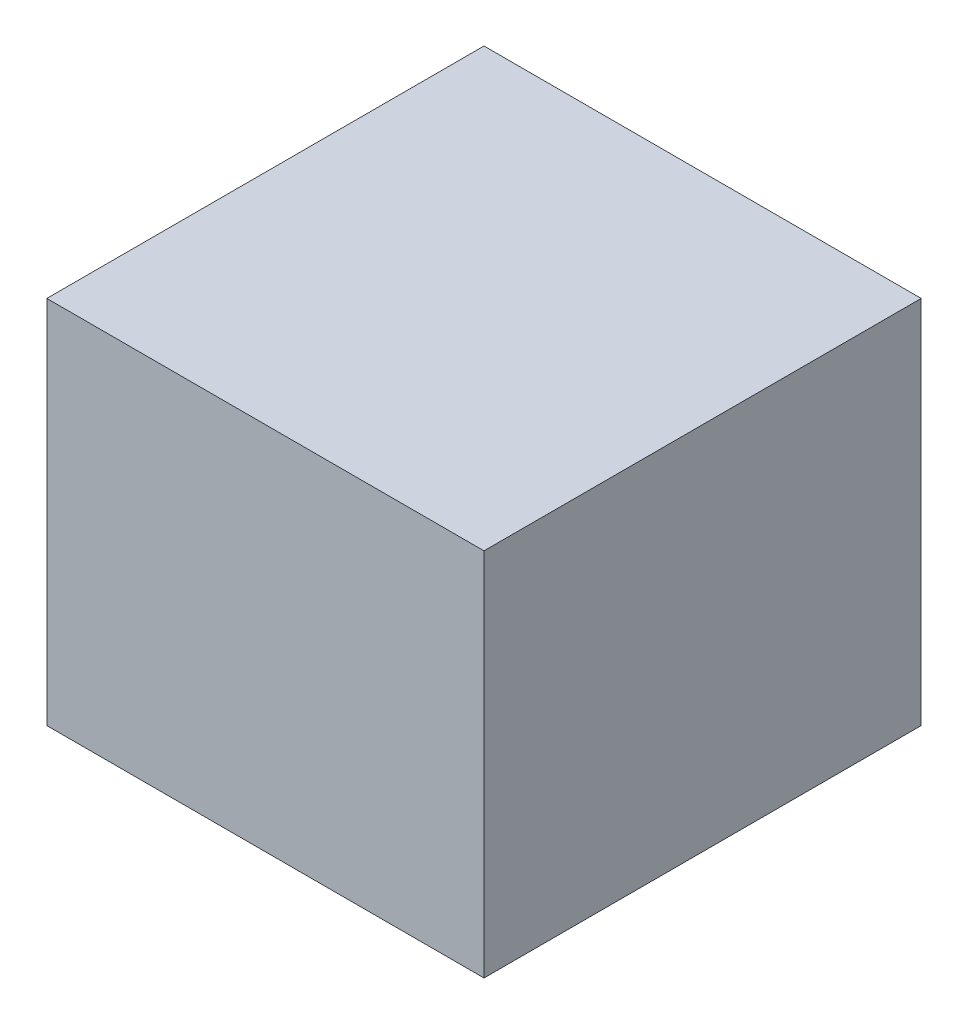
ISO-10303-21;
HEADER;
FILE_DESCRIPTION(('STEP AP214'),'2;1');
FILE_NAME('part.step','',(''),(''),'','','');
FILE_SCHEMA(('AUTOMOTIVE_DESIGN { 1 0 10303 214 1 1 1 1 }'));
ENDSEC;
DATA;
#1=APPLICATION_CONTEXT('core data for automotive mechanical design processes');
#2=APPLICATION_PROTOCOL_DEFINITION('international standard','automotive_design',2000,#1);
#3=PRODUCT_CONTEXT('',#1,'mechanical');
#4=PRODUCT('Part','Part','',(#3));
#5=PRODUCT_RELATED_PRODUCT_CATEGORY('part','',(#4));
#6=PRODUCT_DEFINITION_FORMATION('','',#4);
#7=PRODUCT_DEFINITION_CONTEXT('part definition',#1,'design');
#8=PRODUCT_DEFINITION('design','',#6,#7);
#9=PRODUCT_DEFINITION_SHAPE('','',#8);
#10=(LENGTH_UNIT() NAMED_UNIT(*) SI_UNIT(.MILLI.,.METRE.));
#11=(NAMED_UNIT(*) PLANE_ANGLE_UNIT() SI_UNIT($,.RADIAN.));
#12=(NAMED_UNIT(*) SI_UNIT($,.STERADIAN.) SOLID_ANGLE_UNIT());
#13=UNCERTAINTY_MEASURE_WITH_UNIT(LENGTH_MEASURE(1.E-05),#10,'distance_accuracy_value','');
#14=(GEOMETRIC_REPRESENTATION_CONTEXT(3) GLOBAL_UNCERTAINTY_ASSIGNED_CONTEXT((#13)) GLOBAL_UNIT_ASSIGNED_CONTEXT((#10,
#11,#12)) REPRESENTATION_CONTEXT('',''));
#15=CARTESIAN_POINT('',(0.,0.,0.));
#16=DIRECTION('',(0.,0.,1.));
#17=DIRECTION('',(1.,0.,0.));
#18=AXIS2_PLACEMENT_3D('',#15,#16,#17);
#19=CARTESIAN_POINT('',(165.1,-139.7,-165.1));
#20=DIRECTION('',(0.,0.,1.));
#21=DIRECTION('',(1.,0.,0.));
#22=AXIS2_PLACEMENT_3D('',#19,#20,#21);
#23=PLANE('',#22);
#24=DIRECTION('',(0.,1.,0.));
#25=VECTOR('',#24,1.);
#26=CARTESIAN_POINT('',(-165.1,-139.7,-165.1));
#27=LINE('',#26,#25);
#28=CARTESIAN_POINT('',(-165.1,-139.7,-165.1));
#29=VERTEX_POINT('',#28);
#30=CARTESIAN_POINT('',(-165.1,139.7,-165.1));
#31=VERTEX_POINT('',#30);
#32=EDGE_CURVE('E97',#29,#31,#27,.T.);
#33=ORIENTED_EDGE('',*,*,#32,.T.);
#34=DIRECTION('',(-1.,0.,0.));
#35=VECTOR('',#34,1.);
#36=CARTESIAN_POINT('',(165.1,139.7,-165.1));
#37=LINE('',#36,#35);
#38=CARTESIAN_POINT('',(165.1,139.7,-165.1));
#39=VERTEX_POINT('',#38);
#40=EDGE_CURVE('E11',#39,#31,#37,.T.);
#41=ORIENTED_EDGE('',*,*,#40,.F.);
#42=DIRECTION('',(0.,1.,0.));
#43=VECTOR('',#42,1.);
#44=CARTESIAN_POINT('',(165.1,-139.7,-165.1));
#45=LINE('',#44,#43);
#46=CARTESIAN_POINT('',(165.1,-139.7,-165.1));
#47=VERTEX_POINT('',#46);
#48=EDGE_CURVE('E85',#47,#39,#45,.T.);
#49=ORIENTED_EDGE('',*,*,#48,.F.);
#50=DIRECTION('',(-1.,0.,0.));
#51=VECTOR('',#50,1.);
#52=CARTESIAN_POINT('',(165.1,-139.7,-165.1));
#53=LINE('',#52,#51);
#54=EDGE_CURVE('E93',#47,#29,#53,.T.);
#55=ORIENTED_EDGE('',*,*,#54,.T.);
#56=EDGE_LOOP('',(#33,#41,#49,#55));
#57=FACE_BOUND('',#56,.T.);
#58=ADVANCED_FACE('F34',(#57),#23,.F.);
#59=CARTESIAN_POINT('',(165.1,139.7,165.1));
#60=DIRECTION('',(0.,-1.,0.));
#61=DIRECTION('',(0.,0.,-1.));
#62=AXIS2_PLACEMENT_3D('',#59,#60,#61);
#63=PLANE('',#62);
#64=DIRECTION('',(0.,0.,1.));
#65=VECTOR('',#64,1.);
#66=CARTESIAN_POINT('',(-165.1,139.7,165.1));
#67=LINE('',#66,#65);
#68=CARTESIAN_POINT('',(-165.1,139.7,165.1));
#69=VERTEX_POINT('',#68);
#70=EDGE_CURVE('E89',#31,#69,#67,.T.);
#71=ORIENTED_EDGE('',*,*,#70,.T.);
#72=DIRECTION('',(-1.,0.,0.));
#73=VECTOR('',#72,1.);
#74=CARTESIAN_POINT('',(165.1,139.7,165.1));
#75=LINE('',#74,#73);
#76=CARTESIAN_POINT('',(165.1,139.7,165.1));
#77=VERTEX_POINT('',#76);
#78=EDGE_CURVE('E42',#77,#69,#75,.T.);
#79=ORIENTED_EDGE('',*,*,#78,.F.);
#80=DIRECTION('',(0.,0.,1.));
#81=VECTOR('',#80,1.);
#82=CARTESIAN_POINT('',(165.1,139.7,165.1));
#83=LINE('',#82,#81);
#84=EDGE_CURVE('E80',#39,#77,#83,.T.);
#85=ORIENTED_EDGE('',*,*,#84,.F.);
#86=ORIENTED_EDGE('',*,*,#40,.T.);
#87=EDGE_LOOP('',(#71,#79,#85,#86));
#88=FACE_BOUND('',#87,.T.);
#89=ADVANCED_FACE('F88',(#88),#63,.F.);
#90=CARTESIAN_POINT('',(165.1,-139.7,165.1));
#91=DIRECTION('',(0.,0.,-1.));
#92=DIRECTION('',(-1.,0.,0.));
#93=AXIS2_PLACEMENT_3D('',#90,#91,#92);
#94=PLANE('',#93);
#95=DIRECTION('',(0.,-1.,0.));
#96=VECTOR('',#95,1.);
#97=CARTESIAN_POINT('',(-165.1,-139.7,165.1));
#98=LINE('',#97,#96);
#99=CARTESIAN_POINT('',(-165.1,-139.7,165.1));
#100=VERTEX_POINT('',#99);
#101=EDGE_CURVE('E67',#69,#100,#98,.T.);
#102=ORIENTED_EDGE('',*,*,#101,.T.);
#103=DIRECTION('',(-1.,0.,0.));
#104=VECTOR('',#103,1.);
#105=CARTESIAN_POINT('',(165.1,-139.7,165.1));
#106=LINE('',#105,#104);
#107=CARTESIAN_POINT('',(165.1,-139.7,165.1));
#108=VERTEX_POINT('',#107);
#109=EDGE_CURVE('E90',#108,#100,#106,.T.);
#110=ORIENTED_EDGE('',*,*,#109,.F.);
#111=DIRECTION('',(0.,-1.,0.));
#112=VECTOR('',#111,1.);
#113=CARTESIAN_POINT('',(165.1,-139.7,165.1));
#114=LINE('',#113,#112);
#115=EDGE_CURVE('E83',#77,#108,#114,.T.);
#116=ORIENTED_EDGE('',*,*,#115,.F.);
#117=ORIENTED_EDGE('',*,*,#78,.T.);
#118=EDGE_LOOP('',(#102,#110,#116,#117));
#119=FACE_BOUND('',#118,.T.);
#120=ADVANCED_FACE('F91',(#119),#94,.F.);
#121=CARTESIAN_POINT('',(165.1,-139.7,165.1));
#122=DIRECTION('',(0.,1.,0.));
#123=DIRECTION('',(0.,0.,1.));
#124=AXIS2_PLACEMENT_3D('',#121,#122,#123);
#125=PLANE('',#124);
#126=DIRECTION('',(0.,0.,-1.));
#127=VECTOR('',#126,1.);
#128=CARTESIAN_POINT('',(-165.1,-139.7,165.1));
#129=LINE('',#128,#127);
#130=EDGE_CURVE('E73',#100,#29,#129,.T.);
#131=ORIENTED_EDGE('',*,*,#130,.T.);
#132=ORIENTED_EDGE('',*,*,#54,.F.);
#133=DIRECTION('',(0.,0.,-1.));
#134=VECTOR('',#133,1.);
#135=CARTESIAN_POINT('',(165.1,-139.7,165.1));
#136=LINE('',#135,#134);
#137=EDGE_CURVE('E50',#108,#47,#136,.T.);
#138=ORIENTED_EDGE('',*,*,#137,.F.);
#139=ORIENTED_EDGE('',*,*,#109,.T.);
#140=EDGE_LOOP('',(#131,#132,#138,#139));
#141=FACE_BOUND('',#140,.T.);
#142=ADVANCED_FACE('F104',(#141),#125,.F.);
#143=CARTESIAN_POINT('',(165.1,0.,0.));
#144=DIRECTION('',(-1.,0.,0.));
#145=DIRECTION('',(0.,0.,1.));
#146=AXIS2_PLACEMENT_3D('',#143,#144,#145);
#147=PLANE('',#146);
#148=ORIENTED_EDGE('',*,*,#48,.T.);
#149=ORIENTED_EDGE('',*,*,#84,.T.);
#150=ORIENTED_EDGE('',*,*,#115,.T.);
#151=ORIENTED_EDGE('',*,*,#137,.T.);
#152=EDGE_LOOP('',(#148,#149,#150,#151));
#153=FACE_BOUND('',#152,.T.);
#154=ADVANCED_FACE('F81',(#153),#147,.F.);
#155=CARTESIAN_POINT('',(-165.1,0.,0.));
#156=DIRECTION('',(-1.,0.,0.));
#157=DIRECTION('',(0.,0.,1.));
#158=AXIS2_PLACEMENT_3D('',#155,#156,#157);
#159=PLANE('',#158);
#160=ORIENTED_EDGE('',*,*,#32,.F.);
#161=ORIENTED_EDGE('',*,*,#130,.F.);
#162=ORIENTED_EDGE('',*,*,#101,.F.);
#163=ORIENTED_EDGE('',*,*,#70,.F.);
#164=EDGE_LOOP('',(#160,#161,#162,#163));
#165=FACE_BOUND('',#164,.T.);
#166=ADVANCED_FACE('F107',(#165),#159,.T.);
#167=CLOSED_SHELL('',(#58,#89,#120,#142,#154,#166));
#168=MANIFOLD_SOLID_BREP('B2',#167);
#169=ADVANCED_BREP_SHAPE_REPRESENTATION('',(#18,#168),#14);
#170=SHAPE_DEFINITION_REPRESENTATION(#9,#169);
ENDSEC;
END-ISO-10303-21;
